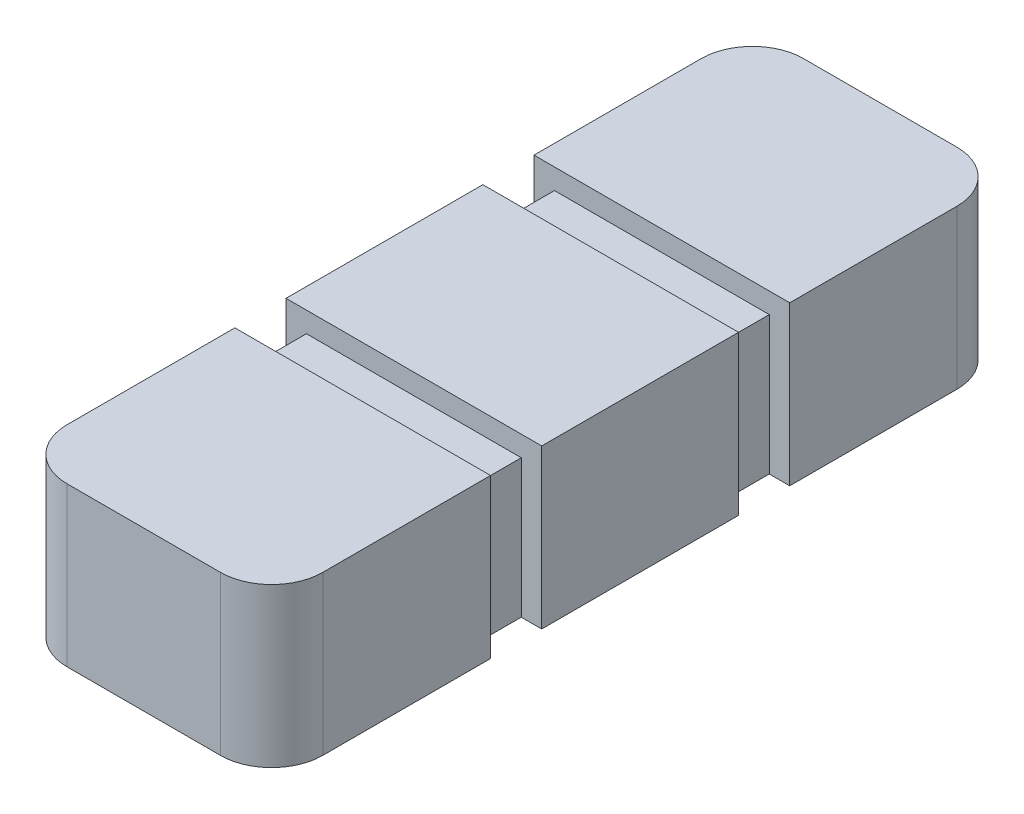
ISO-10303-21;
HEADER;
FILE_DESCRIPTION(('STEP AP214'),'2;1');
FILE_NAME('part.step','',(''),(''),'','','');
FILE_SCHEMA(('AUTOMOTIVE_DESIGN { 1 0 10303 214 1 1 1 1 }'));
ENDSEC;
DATA;
#1=APPLICATION_CONTEXT('core data for automotive mechanical design processes');
#2=APPLICATION_PROTOCOL_DEFINITION('international standard','automotive_design',2000,#1);
#3=PRODUCT_CONTEXT('',#1,'mechanical');
#4=PRODUCT('Part','Part','',(#3));
#5=PRODUCT_RELATED_PRODUCT_CATEGORY('part','',(#4));
#6=PRODUCT_DEFINITION_FORMATION('','',#4);
#7=PRODUCT_DEFINITION_CONTEXT('part definition',#1,'design');
#8=PRODUCT_DEFINITION('design','',#6,#7);
#9=PRODUCT_DEFINITION_SHAPE('','',#8);
#10=(LENGTH_UNIT() NAMED_UNIT(*) SI_UNIT(.MILLI.,.METRE.));
#11=(NAMED_UNIT(*) PLANE_ANGLE_UNIT() SI_UNIT($,.RADIAN.));
#12=(NAMED_UNIT(*) SI_UNIT($,.STERADIAN.) SOLID_ANGLE_UNIT());
#13=UNCERTAINTY_MEASURE_WITH_UNIT(LENGTH_MEASURE(1.E-05),#10,'distance_accuracy_value','');
#14=(GEOMETRIC_REPRESENTATION_CONTEXT(3) GLOBAL_UNCERTAINTY_ASSIGNED_CONTEXT((#13)) GLOBAL_UNIT_ASSIGNED_CONTEXT((#10,
#11,#12)) REPRESENTATION_CONTEXT('',''));
#15=CARTESIAN_POINT('',(0.,0.,0.));
#16=DIRECTION('',(0.,0.,1.));
#17=DIRECTION('',(1.,0.,0.));
#18=AXIS2_PLACEMENT_3D('',#15,#16,#17);
#19=CARTESIAN_POINT('',(1.5,2.325,12.369447531097));
#20=DIRECTION('',(1.,0.,0.));
#21=DIRECTION('',(0.,0.,-1.));
#22=AXIS2_PLACEMENT_3D('',#19,#20,#21);
#23=PLANE('',#22);
#24=DIRECTION('',(0.,0.,-1.));
#25=VECTOR('',#24,1.);
#26=CARTESIAN_POINT('',(1.5,1.65,11.764723765548));
#27=LINE('',#26,#25);
#28=CARTESIAN_POINT('',(1.5,1.65,12.619447531097));
#29=VERTEX_POINT('',#28);
#30=CARTESIAN_POINT('',(1.5,1.65,12.119447531097));
#31=VERTEX_POINT('',#30);
#32=EDGE_CURVE('E367',#29,#31,#27,.T.);
#33=ORIENTED_EDGE('',*,*,#32,.F.);
#34=DIRECTION('',(0.,-1.,0.));
#35=VECTOR('',#34,1.);
#36=CARTESIAN_POINT('',(1.5,3.,12.619447531097));
#37=LINE('',#36,#35);
#38=CARTESIAN_POINT('',(1.5,3.,12.619447531097));
#39=VERTEX_POINT('',#38);
#40=EDGE_CURVE('E36',#39,#29,#37,.T.);
#41=ORIENTED_EDGE('',*,*,#40,.F.);
#42=DIRECTION('',(0.,0.,1.));
#43=VECTOR('',#42,1.);
#44=CARTESIAN_POINT('',(1.5,3.,12.369447531097));
#45=LINE('',#44,#43);
#46=CARTESIAN_POINT('',(1.5,3.,12.119447531097));
#47=VERTEX_POINT('',#46);
#48=EDGE_CURVE('E239',#47,#39,#45,.T.);
#49=ORIENTED_EDGE('',*,*,#48,.F.);
#50=DIRECTION('',(0.,1.,0.));
#51=VECTOR('',#50,1.);
#52=CARTESIAN_POINT('',(1.5,1.65,12.119447531097));
#53=LINE('',#52,#51);
#54=EDGE_CURVE('E258',#31,#47,#53,.T.);
#55=ORIENTED_EDGE('',*,*,#54,.F.);
#56=EDGE_LOOP('',(#33,#41,#49,#55));
#57=FACE_BOUND('',#56,.T.);
#58=ADVANCED_FACE('F17',(#57),#23,.F.);
#59=CARTESIAN_POINT('',(1.5,2.325,9.945));
#60=DIRECTION('',(1.,0.,0.));
#61=DIRECTION('',(0.,0.,-1.));
#62=AXIS2_PLACEMENT_3D('',#59,#60,#61);
#63=PLANE('',#62);
#64=DIRECTION('',(0.,0.,-1.));
#65=VECTOR('',#64,1.);
#66=CARTESIAN_POINT('',(1.5,1.65,10.5525));
#67=LINE('',#66,#65);
#68=CARTESIAN_POINT('',(1.5,1.65,10.195));
#69=VERTEX_POINT('',#68);
#70=CARTESIAN_POINT('',(1.5,1.65,9.695));
#71=VERTEX_POINT('',#70);
#72=EDGE_CURVE('E375',#69,#71,#67,.T.);
#73=ORIENTED_EDGE('',*,*,#72,.F.);
#74=DIRECTION('',(0.,-1.,0.));
#75=VECTOR('',#74,1.);
#76=CARTESIAN_POINT('',(1.5,3.,10.195));
#77=LINE('',#76,#75);
#78=CARTESIAN_POINT('',(1.5,3.,10.195));
#79=VERTEX_POINT('',#78);
#80=EDGE_CURVE('E285',#79,#69,#77,.T.);
#81=ORIENTED_EDGE('',*,*,#80,.F.);
#82=DIRECTION('',(0.,0.,1.));
#83=VECTOR('',#82,1.);
#84=CARTESIAN_POINT('',(1.5,3.,9.945));
#85=LINE('',#84,#83);
#86=CARTESIAN_POINT('',(1.5,3.,9.695));
#87=VERTEX_POINT('',#86);
#88=EDGE_CURVE('E251',#87,#79,#85,.T.);
#89=ORIENTED_EDGE('',*,*,#88,.F.);
#90=DIRECTION('',(0.,1.,0.));
#91=VECTOR('',#90,1.);
#92=CARTESIAN_POINT('',(1.5,1.65,9.695));
#93=LINE('',#92,#91);
#94=EDGE_CURVE('E288',#71,#87,#93,.T.);
#95=ORIENTED_EDGE('',*,*,#94,.F.);
#96=EDGE_LOOP('',(#73,#81,#89,#95));
#97=FACE_BOUND('',#96,.T.);
#98=ADVANCED_FACE('F408',(#97),#63,.F.);
#99=CARTESIAN_POINT('',(1.3,1.65,7.56));
#100=DIRECTION('',(-1.,0.,0.));
#101=DIRECTION('',(0.,0.,1.));
#102=AXIS2_PLACEMENT_3D('',#99,#100,#101);
#103=PLANE('',#102);
#104=DIRECTION('',(0.,1.,0.));
#105=VECTOR('',#104,1.);
#106=CARTESIAN_POINT('',(1.3,2.425,9.695));
#107=LINE('',#106,#105);
#108=CARTESIAN_POINT('',(1.3,1.65,9.695));
#109=VERTEX_POINT('',#108);
#110=CARTESIAN_POINT('',(1.3,3.2,9.695));
#111=VERTEX_POINT('',#110);
#112=EDGE_CURVE('E11',#109,#111,#107,.T.);
#113=ORIENTED_EDGE('',*,*,#112,.T.);
#114=DIRECTION('',(0.,0.,1.));
#115=VECTOR('',#114,1.);
#116=CARTESIAN_POINT('',(1.3,3.2,14.76));
#117=LINE('',#116,#115);
#118=CARTESIAN_POINT('',(1.3,3.2,8.06));
#119=VERTEX_POINT('',#118);
#120=EDGE_CURVE('E199',#119,#111,#117,.T.);
#121=ORIENTED_EDGE('',*,*,#120,.F.);
#122=DIRECTION('',(0.,1.,0.));
#123=VECTOR('',#122,1.);
#124=CARTESIAN_POINT('',(1.3,1.65,8.06));
#125=LINE('',#124,#123);
#126=CARTESIAN_POINT('',(1.3,1.65,8.06));
#127=VERTEX_POINT('',#126);
#128=EDGE_CURVE('E188',#127,#119,#125,.T.);
#129=ORIENTED_EDGE('',*,*,#128,.F.);
#130=DIRECTION('',(0.,0.,-1.));
#131=VECTOR('',#130,1.);
#132=CARTESIAN_POINT('',(1.3,1.65,14.76));
#133=LINE('',#132,#131);
#134=EDGE_CURVE('E378',#109,#127,#133,.T.);
#135=ORIENTED_EDGE('',*,*,#134,.F.);
#136=EDGE_LOOP('',(#113,#121,#129,#135));
#137=FACE_BOUND('',#136,.T.);
#138=ADVANCED_FACE('F415',(#137),#103,.T.);
#139=CARTESIAN_POINT('',(1.3,1.65,7.56));
#140=DIRECTION('',(-1.,0.,0.));
#141=DIRECTION('',(0.,0.,1.));
#142=AXIS2_PLACEMENT_3D('',#139,#140,#141);
#143=PLANE('',#142);
#144=DIRECTION('',(0.,1.,0.));
#145=VECTOR('',#144,1.);
#146=CARTESIAN_POINT('',(1.3,2.425,12.119447531097));
#147=LINE('',#146,#145);
#148=CARTESIAN_POINT('',(1.3,1.65,12.119447531097));
#149=VERTEX_POINT('',#148);
#150=CARTESIAN_POINT('',(1.3,3.2,12.119447531097));
#151=VERTEX_POINT('',#150);
#152=EDGE_CURVE('E27',#149,#151,#147,.T.);
#153=ORIENTED_EDGE('',*,*,#152,.T.);
#154=DIRECTION('',(0.,0.,1.));
#155=VECTOR('',#154,1.);
#156=CARTESIAN_POINT('',(1.3,3.2,14.76));
#157=LINE('',#156,#155);
#158=CARTESIAN_POINT('',(1.3,3.2,10.195));
#159=VERTEX_POINT('',#158);
#160=EDGE_CURVE('E291',#159,#151,#157,.T.);
#161=ORIENTED_EDGE('',*,*,#160,.F.);
#162=DIRECTION('',(0.,-1.,0.));
#163=VECTOR('',#162,1.);
#164=CARTESIAN_POINT('',(1.3,2.425,10.195));
#165=LINE('',#164,#163);
#166=CARTESIAN_POINT('',(1.3,1.65,10.195));
#167=VERTEX_POINT('',#166);
#168=EDGE_CURVE('E389',#159,#167,#165,.T.);
#169=ORIENTED_EDGE('',*,*,#168,.T.);
#170=DIRECTION('',(0.,0.,-1.));
#171=VECTOR('',#170,1.);
#172=CARTESIAN_POINT('',(1.3,1.65,14.76));
#173=LINE('',#172,#171);
#174=EDGE_CURVE('E371',#149,#167,#173,.T.);
#175=ORIENTED_EDGE('',*,*,#174,.F.);
#176=EDGE_LOOP('',(#153,#161,#169,#175));
#177=FACE_BOUND('',#176,.T.);
#178=ADVANCED_FACE('F398',(#177),#143,.T.);
#179=CARTESIAN_POINT('',(1.3,1.65,7.56));
#180=DIRECTION('',(-1.,0.,0.));
#181=DIRECTION('',(0.,0.,1.));
#182=AXIS2_PLACEMENT_3D('',#179,#180,#181);
#183=PLANE('',#182);
#184=DIRECTION('',(0.,-1.,0.));
#185=VECTOR('',#184,1.);
#186=CARTESIAN_POINT('',(1.3,2.425,12.619447531097));
#187=LINE('',#186,#185);
#188=CARTESIAN_POINT('',(1.3,3.2,12.619447531097));
#189=VERTEX_POINT('',#188);
#190=CARTESIAN_POINT('',(1.3,1.65,12.619447531097));
#191=VERTEX_POINT('',#190);
#192=EDGE_CURVE('E357',#189,#191,#187,.T.);
#193=ORIENTED_EDGE('',*,*,#192,.T.);
#194=DIRECTION('',(0.,0.,-1.));
#195=VECTOR('',#194,1.);
#196=CARTESIAN_POINT('',(1.3,1.65,14.76));
#197=LINE('',#196,#195);
#198=CARTESIAN_POINT('',(1.3,1.65,14.26));
#199=VERTEX_POINT('',#198);
#200=EDGE_CURVE('E227',#199,#191,#197,.T.);
#201=ORIENTED_EDGE('',*,*,#200,.F.);
#202=DIRECTION('',(0.,-1.,0.));
#203=VECTOR('',#202,1.);
#204=CARTESIAN_POINT('',(1.3,1.65,14.26));
#205=LINE('',#204,#203);
#206=CARTESIAN_POINT('',(1.3,3.2,14.26));
#207=VERTEX_POINT('',#206);
#208=EDGE_CURVE('E230',#207,#199,#205,.T.);
#209=ORIENTED_EDGE('',*,*,#208,.F.);
#210=DIRECTION('',(0.,0.,1.));
#211=VECTOR('',#210,1.);
#212=CARTESIAN_POINT('',(1.3,3.2,14.76));
#213=LINE('',#212,#211);
#214=EDGE_CURVE('E295',#189,#207,#213,.T.);
#215=ORIENTED_EDGE('',*,*,#214,.F.);
#216=EDGE_LOOP('',(#193,#201,#209,#215));
#217=FACE_BOUND('',#216,.T.);
#218=ADVANCED_FACE('F355',(#217),#183,.T.);
#219=CARTESIAN_POINT('',(2.55,1.65,11.16));
#220=DIRECTION('',(0.,1.,0.));
#221=DIRECTION('',(-1.,0.,0.));
#222=AXIS2_PLACEMENT_3D('',#219,#220,#221);
#223=PLANE('',#222);
#224=DIRECTION('',(1.,0.,0.));
#225=VECTOR('',#224,1.);
#226=CARTESIAN_POINT('',(1.925,1.65,12.619447531097));
#227=LINE('',#226,#225);
#228=EDGE_CURVE('E365',#191,#29,#227,.T.);
#229=ORIENTED_EDGE('',*,*,#228,.T.);
#230=ORIENTED_EDGE('',*,*,#32,.T.);
#231=DIRECTION('',(-1.,0.,0.));
#232=VECTOR('',#231,1.);
#233=CARTESIAN_POINT('',(1.925,1.65,12.119447531097));
#234=LINE('',#233,#232);
#235=EDGE_CURVE('E368',#31,#149,#234,.T.);
#236=ORIENTED_EDGE('',*,*,#235,.T.);
#237=ORIENTED_EDGE('',*,*,#174,.T.);
#238=DIRECTION('',(1.,0.,0.));
#239=VECTOR('',#238,1.);
#240=CARTESIAN_POINT('',(1.925,1.65,10.195));
#241=LINE('',#240,#239);
#242=EDGE_CURVE('E372',#167,#69,#241,.T.);
#243=ORIENTED_EDGE('',*,*,#242,.T.);
#244=ORIENTED_EDGE('',*,*,#72,.T.);
#245=DIRECTION('',(-1.,0.,0.));
#246=VECTOR('',#245,1.);
#247=CARTESIAN_POINT('',(1.925,1.65,9.695));
#248=LINE('',#247,#246);
#249=EDGE_CURVE('E376',#71,#109,#248,.T.);
#250=ORIENTED_EDGE('',*,*,#249,.T.);
#251=ORIENTED_EDGE('',*,*,#134,.T.);
#252=CARTESIAN_POINT('',(1.8,1.65,8.06));
#253=DIRECTION('',(0.,1.,0.));
#254=DIRECTION('',(-0.707106781186548,0.,-0.707106781186548));
#255=AXIS2_PLACEMENT_3D('',#252,#253,#254);
#256=CIRCLE('',#255,0.5);
#257=CARTESIAN_POINT('',(1.8,1.65,7.56));
#258=VERTEX_POINT('',#257);
#259=EDGE_CURVE('E205',#258,#127,#256,.T.);
#260=ORIENTED_EDGE('',*,*,#259,.F.);
#261=DIRECTION('',(1.,0.,0.));
#262=VECTOR('',#261,1.);
#263=CARTESIAN_POINT('',(1.3,1.65,7.56));
#264=LINE('',#263,#262);
#265=CARTESIAN_POINT('',(3.3,1.65,7.56));
#266=VERTEX_POINT('',#265);
#267=EDGE_CURVE('E204',#258,#266,#264,.T.);
#268=ORIENTED_EDGE('',*,*,#267,.T.);
#269=CARTESIAN_POINT('',(3.3,1.65,8.06));
#270=DIRECTION('',(0.,1.,0.));
#271=DIRECTION('',(0.707106781186548,0.,-0.707106781186548));
#272=AXIS2_PLACEMENT_3D('',#269,#270,#271);
#273=CIRCLE('',#272,0.5);
#274=CARTESIAN_POINT('',(3.8,1.65,8.06));
#275=VERTEX_POINT('',#274);
#276=EDGE_CURVE('E265',#275,#266,#273,.T.);
#277=ORIENTED_EDGE('',*,*,#276,.F.);
#278=DIRECTION('',(0.,0.,1.));
#279=VECTOR('',#278,1.);
#280=CARTESIAN_POINT('',(3.8,1.65,7.56));
#281=LINE('',#280,#279);
#282=CARTESIAN_POINT('',(3.8,1.65,9.695));
#283=VERTEX_POINT('',#282);
#284=EDGE_CURVE('E308',#275,#283,#281,.T.);
#285=ORIENTED_EDGE('',*,*,#284,.T.);
#286=DIRECTION('',(-1.,0.,0.));
#287=VECTOR('',#286,1.);
#288=CARTESIAN_POINT('',(3.175,1.65,9.695));
#289=LINE('',#288,#287);
#290=CARTESIAN_POINT('',(3.6,1.65,9.695));
#291=VERTEX_POINT('',#290);
#292=EDGE_CURVE('E311',#283,#291,#289,.T.);
#293=ORIENTED_EDGE('',*,*,#292,.T.);
#294=DIRECTION('',(0.,0.,1.));
#295=VECTOR('',#294,1.);
#296=CARTESIAN_POINT('',(3.6,1.65,10.5525));
#297=LINE('',#296,#295);
#298=CARTESIAN_POINT('',(3.6,1.65,10.195));
#299=VERTEX_POINT('',#298);
#300=EDGE_CURVE('E314',#291,#299,#297,.T.);
#301=ORIENTED_EDGE('',*,*,#300,.T.);
#302=DIRECTION('',(1.,0.,0.));
#303=VECTOR('',#302,1.);
#304=CARTESIAN_POINT('',(3.175,1.65,10.195));
#305=LINE('',#304,#303);
#306=CARTESIAN_POINT('',(3.8,1.65,10.195));
#307=VERTEX_POINT('',#306);
#308=EDGE_CURVE('E317',#299,#307,#305,.T.);
#309=ORIENTED_EDGE('',*,*,#308,.T.);
#310=DIRECTION('',(0.,0.,1.));
#311=VECTOR('',#310,1.);
#312=CARTESIAN_POINT('',(3.8,1.65,7.56));
#313=LINE('',#312,#311);
#314=CARTESIAN_POINT('',(3.8,1.65,12.119447531097));
#315=VERTEX_POINT('',#314);
#316=EDGE_CURVE('E320',#307,#315,#313,.T.);
#317=ORIENTED_EDGE('',*,*,#316,.T.);
#318=DIRECTION('',(-1.,0.,0.));
#319=VECTOR('',#318,1.);
#320=CARTESIAN_POINT('',(3.175,1.65,12.119447531097));
#321=LINE('',#320,#319);
#322=CARTESIAN_POINT('',(3.6,1.65,12.119447531097));
#323=VERTEX_POINT('',#322);
#324=EDGE_CURVE('E323',#315,#323,#321,.T.);
#325=ORIENTED_EDGE('',*,*,#324,.T.);
#326=DIRECTION('',(0.,0.,1.));
#327=VECTOR('',#326,1.);
#328=CARTESIAN_POINT('',(3.6,1.65,11.764723765548));
#329=LINE('',#328,#327);
#330=CARTESIAN_POINT('',(3.6,1.65,12.619447531097));
#331=VERTEX_POINT('',#330);
#332=EDGE_CURVE('E326',#323,#331,#329,.T.);
#333=ORIENTED_EDGE('',*,*,#332,.T.);
#334=DIRECTION('',(1.,0.,0.));
#335=VECTOR('',#334,1.);
#336=CARTESIAN_POINT('',(3.175,1.65,12.619447531097));
#337=LINE('',#336,#335);
#338=CARTESIAN_POINT('',(3.8,1.65,12.619447531097));
#339=VERTEX_POINT('',#338);
#340=EDGE_CURVE('E328',#331,#339,#337,.T.);
#341=ORIENTED_EDGE('',*,*,#340,.T.);
#342=DIRECTION('',(0.,0.,1.));
#343=VECTOR('',#342,1.);
#344=CARTESIAN_POINT('',(3.8,1.65,7.56));
#345=LINE('',#344,#343);
#346=CARTESIAN_POINT('',(3.8,1.65,14.26));
#347=VERTEX_POINT('',#346);
#348=EDGE_CURVE('E222',#339,#347,#345,.T.);
#349=ORIENTED_EDGE('',*,*,#348,.T.);
#350=CARTESIAN_POINT('',(3.3,1.65,14.26));
#351=DIRECTION('',(0.,1.,0.));
#352=DIRECTION('',(0.707106781186548,0.,0.707106781186548));
#353=AXIS2_PLACEMENT_3D('',#350,#351,#352);
#354=CIRCLE('',#353,0.5);
#355=CARTESIAN_POINT('',(3.3,1.65,14.76));
#356=VERTEX_POINT('',#355);
#357=EDGE_CURVE('E212',#356,#347,#354,.T.);
#358=ORIENTED_EDGE('',*,*,#357,.F.);
#359=DIRECTION('',(-1.,0.,0.));
#360=VECTOR('',#359,1.);
#361=CARTESIAN_POINT('',(3.8,1.65,14.76));
#362=LINE('',#361,#360);
#363=CARTESIAN_POINT('',(1.8,1.65,14.76));
#364=VERTEX_POINT('',#363);
#365=EDGE_CURVE('E224',#356,#364,#362,.T.);
#366=ORIENTED_EDGE('',*,*,#365,.T.);
#367=CARTESIAN_POINT('',(1.8,1.65,14.26));
#368=DIRECTION('',(0.,1.,0.));
#369=DIRECTION('',(-0.707106781186548,0.,0.707106781186548));
#370=AXIS2_PLACEMENT_3D('',#367,#368,#369);
#371=CIRCLE('',#370,0.5);
#372=EDGE_CURVE('E228',#199,#364,#371,.T.);
#373=ORIENTED_EDGE('',*,*,#372,.F.);
#374=ORIENTED_EDGE('',*,*,#200,.T.);
#375=EDGE_LOOP('',(#229,#230,#236,#237,#243,#244,#250,#251,#260,#268,#277,#285,#293,#301,#309,
#317,#325,#333,#341,#349,#358,#366,#373,#374));
#376=FACE_BOUND('',#375,.T.);
#377=ADVANCED_FACE('F334',(#376),#223,.F.);
#378=CARTESIAN_POINT('',(3.6,2.325,12.369447531097));
#379=DIRECTION('',(-1.,0.,0.));
#380=DIRECTION('',(0.,0.,1.));
#381=AXIS2_PLACEMENT_3D('',#378,#379,#380);
#382=PLANE('',#381);
#383=DIRECTION('',(0.,-1.,0.));
#384=VECTOR('',#383,1.);
#385=CARTESIAN_POINT('',(3.6,1.65,12.119447531097));
#386=LINE('',#385,#384);
#387=CARTESIAN_POINT('',(3.6,3.,12.119447531097));
#388=VERTEX_POINT('',#387);
#389=EDGE_CURVE('E231',#388,#323,#386,.T.);
#390=ORIENTED_EDGE('',*,*,#389,.F.);
#391=DIRECTION('',(0.,0.,-1.));
#392=VECTOR('',#391,1.);
#393=CARTESIAN_POINT('',(3.6,3.,12.369447531097));
#394=LINE('',#393,#392);
#395=CARTESIAN_POINT('',(3.6,3.,12.619447531097));
#396=VERTEX_POINT('',#395);
#397=EDGE_CURVE('E236',#396,#388,#394,.T.);
#398=ORIENTED_EDGE('',*,*,#397,.F.);
#399=DIRECTION('',(0.,1.,0.));
#400=VECTOR('',#399,1.);
#401=CARTESIAN_POINT('',(3.6,3.,12.619447531097));
#402=LINE('',#401,#400);
#403=EDGE_CURVE('E241',#331,#396,#402,.T.);
#404=ORIENTED_EDGE('',*,*,#403,.F.);
#405=ORIENTED_EDGE('',*,*,#332,.F.);
#406=EDGE_LOOP('',(#390,#398,#404,#405));
#407=FACE_BOUND('',#406,.T.);
#408=ADVANCED_FACE('F468',(#407),#382,.F.);
#409=CARTESIAN_POINT('',(3.6,2.325,9.945));
#410=DIRECTION('',(-1.,0.,0.));
#411=DIRECTION('',(0.,0.,1.));
#412=AXIS2_PLACEMENT_3D('',#409,#410,#411);
#413=PLANE('',#412);
#414=DIRECTION('',(0.,-1.,0.));
#415=VECTOR('',#414,1.);
#416=CARTESIAN_POINT('',(3.6,1.65,9.695));
#417=LINE('',#416,#415);
#418=CARTESIAN_POINT('',(3.6,3.,9.695));
#419=VERTEX_POINT('',#418);
#420=EDGE_CURVE('E243',#419,#291,#417,.T.);
#421=ORIENTED_EDGE('',*,*,#420,.F.);
#422=DIRECTION('',(0.,0.,-1.));
#423=VECTOR('',#422,1.);
#424=CARTESIAN_POINT('',(3.6,3.,9.945));
#425=LINE('',#424,#423);
#426=CARTESIAN_POINT('',(3.6,3.,10.195));
#427=VERTEX_POINT('',#426);
#428=EDGE_CURVE('E248',#427,#419,#425,.T.);
#429=ORIENTED_EDGE('',*,*,#428,.F.);
#430=DIRECTION('',(0.,1.,0.));
#431=VECTOR('',#430,1.);
#432=CARTESIAN_POINT('',(3.6,3.,10.195));
#433=LINE('',#432,#431);
#434=EDGE_CURVE('E252',#299,#427,#433,.T.);
#435=ORIENTED_EDGE('',*,*,#434,.F.);
#436=ORIENTED_EDGE('',*,*,#300,.F.);
#437=EDGE_LOOP('',(#421,#429,#435,#436));
#438=FACE_BOUND('',#437,.T.);
#439=ADVANCED_FACE('F435',(#438),#413,.F.);
#440=CARTESIAN_POINT('',(2.55,3.,12.369447531097));
#441=DIRECTION('',(0.,-1.,0.));
#442=DIRECTION('',(0.,0.,-1.));
#443=AXIS2_PLACEMENT_3D('',#440,#441,#442);
#444=PLANE('',#443);
#445=ORIENTED_EDGE('',*,*,#48,.T.);
#446=DIRECTION('',(-1.,0.,0.));
#447=VECTOR('',#446,1.);
#448=CARTESIAN_POINT('',(3.8,3.,12.619447531097));
#449=LINE('',#448,#447);
#450=EDGE_CURVE('E244',#396,#39,#449,.T.);
#451=ORIENTED_EDGE('',*,*,#450,.F.);
#452=ORIENTED_EDGE('',*,*,#397,.T.);
#453=DIRECTION('',(1.,0.,0.));
#454=VECTOR('',#453,1.);
#455=CARTESIAN_POINT('',(1.3,3.,12.119447531097));
#456=LINE('',#455,#454);
#457=EDGE_CURVE('E234',#47,#388,#456,.T.);
#458=ORIENTED_EDGE('',*,*,#457,.F.);
#459=EDGE_LOOP('',(#445,#451,#452,#458));
#460=FACE_BOUND('',#459,.T.);
#461=ADVANCED_FACE('F443',(#460),#444,.F.);
#462=CARTESIAN_POINT('',(3.8,1.65,14.76));
#463=DIRECTION('',(1.,0.,0.));
#464=DIRECTION('',(0.,0.,-1.));
#465=AXIS2_PLACEMENT_3D('',#462,#463,#464);
#466=PLANE('',#465);
#467=DIRECTION('',(0.,-1.,0.));
#468=VECTOR('',#467,1.);
#469=CARTESIAN_POINT('',(3.8,2.425,9.695));
#470=LINE('',#469,#468);
#471=CARTESIAN_POINT('',(3.8,3.2,9.695));
#472=VERTEX_POINT('',#471);
#473=EDGE_CURVE('E240',#472,#283,#470,.T.);
#474=ORIENTED_EDGE('',*,*,#473,.T.);
#475=ORIENTED_EDGE('',*,*,#284,.F.);
#476=DIRECTION('',(0.,-1.,0.));
#477=VECTOR('',#476,1.);
#478=CARTESIAN_POINT('',(3.8,1.65,8.06));
#479=LINE('',#478,#477);
#480=CARTESIAN_POINT('',(3.8,3.2,8.06));
#481=VERTEX_POINT('',#480);
#482=EDGE_CURVE('E262',#481,#275,#479,.T.);
#483=ORIENTED_EDGE('',*,*,#482,.F.);
#484=DIRECTION('',(0.,0.,-1.));
#485=VECTOR('',#484,1.);
#486=CARTESIAN_POINT('',(3.8,3.2,7.56));
#487=LINE('',#486,#485);
#488=EDGE_CURVE('E198',#472,#481,#487,.T.);
#489=ORIENTED_EDGE('',*,*,#488,.F.);
#490=EDGE_LOOP('',(#474,#475,#483,#489));
#491=FACE_BOUND('',#490,.T.);
#492=ADVANCED_FACE('F441',(#491),#466,.T.);
#493=CARTESIAN_POINT('',(3.8,1.65,14.76));
#494=DIRECTION('',(1.,0.,0.));
#495=DIRECTION('',(0.,0.,-1.));
#496=AXIS2_PLACEMENT_3D('',#493,#494,#495);
#497=PLANE('',#496);
#498=DIRECTION('',(0.,-1.,0.));
#499=VECTOR('',#498,1.);
#500=CARTESIAN_POINT('',(3.8,2.425,12.119447531097));
#501=LINE('',#500,#499);
#502=CARTESIAN_POINT('',(3.8,3.2,12.119447531097));
#503=VERTEX_POINT('',#502);
#504=EDGE_CURVE('E261',#503,#315,#501,.T.);
#505=ORIENTED_EDGE('',*,*,#504,.T.);
#506=ORIENTED_EDGE('',*,*,#316,.F.);
#507=DIRECTION('',(0.,1.,0.));
#508=VECTOR('',#507,1.);
#509=CARTESIAN_POINT('',(3.8,2.425,10.195));
#510=LINE('',#509,#508);
#511=CARTESIAN_POINT('',(3.8,3.2,10.195));
#512=VERTEX_POINT('',#511);
#513=EDGE_CURVE('E270',#307,#512,#510,.T.);
#514=ORIENTED_EDGE('',*,*,#513,.T.);
#515=DIRECTION('',(0.,0.,-1.));
#516=VECTOR('',#515,1.);
#517=CARTESIAN_POINT('',(3.8,3.2,7.56));
#518=LINE('',#517,#516);
#519=EDGE_CURVE('E274',#503,#512,#518,.T.);
#520=ORIENTED_EDGE('',*,*,#519,.F.);
#521=EDGE_LOOP('',(#505,#506,#514,#520));
#522=FACE_BOUND('',#521,.T.);
#523=ADVANCED_FACE('F431',(#522),#497,.T.);
#524=CARTESIAN_POINT('',(3.8,1.65,14.76));
#525=DIRECTION('',(1.,0.,0.));
#526=DIRECTION('',(0.,0.,-1.));
#527=AXIS2_PLACEMENT_3D('',#524,#525,#526);
#528=PLANE('',#527);
#529=DIRECTION('',(0.,1.,0.));
#530=VECTOR('',#529,1.);
#531=CARTESIAN_POINT('',(3.8,2.425,12.619447531097));
#532=LINE('',#531,#530);
#533=CARTESIAN_POINT('',(3.8,3.2,12.619447531097));
#534=VERTEX_POINT('',#533);
#535=EDGE_CURVE('E273',#339,#534,#532,.T.);
#536=ORIENTED_EDGE('',*,*,#535,.T.);
#537=DIRECTION('',(0.,0.,-1.));
#538=VECTOR('',#537,1.);
#539=CARTESIAN_POINT('',(3.8,3.2,7.56));
#540=LINE('',#539,#538);
#541=CARTESIAN_POINT('',(3.8,3.2,14.26));
#542=VERTEX_POINT('',#541);
#543=EDGE_CURVE('E279',#542,#534,#540,.T.);
#544=ORIENTED_EDGE('',*,*,#543,.F.);
#545=DIRECTION('',(0.,1.,0.));
#546=VECTOR('',#545,1.);
#547=CARTESIAN_POINT('',(3.8,1.65,14.26));
#548=LINE('',#547,#546);
#549=EDGE_CURVE('E216',#347,#542,#548,.T.);
#550=ORIENTED_EDGE('',*,*,#549,.F.);
#551=ORIENTED_EDGE('',*,*,#348,.F.);
#552=EDGE_LOOP('',(#536,#544,#550,#551));
#553=FACE_BOUND('',#552,.T.);
#554=ADVANCED_FACE('F338',(#553),#528,.T.);
#555=CARTESIAN_POINT('',(2.55,3.,9.945));
#556=DIRECTION('',(0.,-1.,0.));
#557=DIRECTION('',(0.,0.,-1.));
#558=AXIS2_PLACEMENT_3D('',#555,#556,#557);
#559=PLANE('',#558);
#560=ORIENTED_EDGE('',*,*,#88,.T.);
#561=DIRECTION('',(-1.,0.,0.));
#562=VECTOR('',#561,1.);
#563=CARTESIAN_POINT('',(3.8,3.,10.195));
#564=LINE('',#563,#562);
#565=EDGE_CURVE('E254',#427,#79,#564,.T.);
#566=ORIENTED_EDGE('',*,*,#565,.F.);
#567=ORIENTED_EDGE('',*,*,#428,.T.);
#568=DIRECTION('',(1.,0.,0.));
#569=VECTOR('',#568,1.);
#570=CARTESIAN_POINT('',(1.3,3.,9.695));
#571=LINE('',#570,#569);
#572=EDGE_CURVE('E247',#87,#419,#571,.T.);
#573=ORIENTED_EDGE('',*,*,#572,.F.);
#574=EDGE_LOOP('',(#560,#566,#567,#573));
#575=FACE_BOUND('',#574,.T.);
#576=ADVANCED_FACE('F438',(#575),#559,.F.);
#577=CARTESIAN_POINT('',(3.8,3.2,10.195));
#578=DIRECTION('',(0.,0.,1.));
#579=DIRECTION('',(-1.,0.,0.));
#580=AXIS2_PLACEMENT_3D('',#577,#578,#579);
#581=PLANE('',#580);
#582=DIRECTION('',(-1.,0.,0.));
#583=VECTOR('',#582,1.);
#584=CARTESIAN_POINT('',(3.175,3.2,10.195));
#585=LINE('',#584,#583);
#586=EDGE_CURVE('E281',#512,#159,#585,.T.);
#587=ORIENTED_EDGE('',*,*,#586,.F.);
#588=ORIENTED_EDGE('',*,*,#513,.F.);
#589=ORIENTED_EDGE('',*,*,#308,.F.);
#590=ORIENTED_EDGE('',*,*,#434,.T.);
#591=ORIENTED_EDGE('',*,*,#565,.T.);
#592=ORIENTED_EDGE('',*,*,#80,.T.);
#593=ORIENTED_EDGE('',*,*,#242,.F.);
#594=ORIENTED_EDGE('',*,*,#168,.F.);
#595=EDGE_LOOP('',(#587,#588,#589,#590,#591,#592,#593,#594));
#596=FACE_BOUND('',#595,.T.);
#597=ADVANCED_FACE('F401',(#596),#581,.F.);
#598=CARTESIAN_POINT('',(1.3,3.2,9.695));
#599=DIRECTION('',(0.,0.,-1.));
#600=DIRECTION('',(1.,0.,0.));
#601=AXIS2_PLACEMENT_3D('',#598,#599,#600);
#602=PLANE('',#601);
#603=DIRECTION('',(1.,0.,0.));
#604=VECTOR('',#603,1.);
#605=CARTESIAN_POINT('',(1.925,3.2,9.695));
#606=LINE('',#605,#604);
#607=EDGE_CURVE('E267',#111,#472,#606,.T.);
#608=ORIENTED_EDGE('',*,*,#607,.F.);
#609=ORIENTED_EDGE('',*,*,#112,.F.);
#610=ORIENTED_EDGE('',*,*,#249,.F.);
#611=ORIENTED_EDGE('',*,*,#94,.T.);
#612=ORIENTED_EDGE('',*,*,#572,.T.);
#613=ORIENTED_EDGE('',*,*,#420,.T.);
#614=ORIENTED_EDGE('',*,*,#292,.F.);
#615=ORIENTED_EDGE('',*,*,#473,.F.);
#616=EDGE_LOOP('',(#608,#609,#610,#611,#612,#613,#614,#615));
#617=FACE_BOUND('',#616,.T.);
#618=ADVANCED_FACE('F412',(#617),#602,.F.);
#619=CARTESIAN_POINT('',(3.8,3.2,12.619447531097));
#620=DIRECTION('',(0.,0.,1.));
#621=DIRECTION('',(-1.,0.,0.));
#622=AXIS2_PLACEMENT_3D('',#619,#620,#621);
#623=PLANE('',#622);
#624=DIRECTION('',(-1.,0.,0.));
#625=VECTOR('',#624,1.);
#626=CARTESIAN_POINT('',(3.175,3.2,12.619447531097));
#627=LINE('',#626,#625);
#628=EDGE_CURVE('E235',#534,#189,#627,.T.);
#629=ORIENTED_EDGE('',*,*,#628,.F.);
#630=ORIENTED_EDGE('',*,*,#535,.F.);
#631=ORIENTED_EDGE('',*,*,#340,.F.);
#632=ORIENTED_EDGE('',*,*,#403,.T.);
#633=ORIENTED_EDGE('',*,*,#450,.T.);
#634=ORIENTED_EDGE('',*,*,#40,.T.);
#635=ORIENTED_EDGE('',*,*,#228,.F.);
#636=ORIENTED_EDGE('',*,*,#192,.F.);
#637=EDGE_LOOP('',(#629,#630,#631,#632,#633,#634,#635,#636));
#638=FACE_BOUND('',#637,.T.);
#639=ADVANCED_FACE('F529',(#638),#623,.F.);
#640=CARTESIAN_POINT('',(1.3,3.2,12.119447531097));
#641=DIRECTION('',(0.,0.,-1.));
#642=DIRECTION('',(1.,0.,0.));
#643=AXIS2_PLACEMENT_3D('',#640,#641,#642);
#644=PLANE('',#643);
#645=DIRECTION('',(1.,0.,0.));
#646=VECTOR('',#645,1.);
#647=CARTESIAN_POINT('',(1.925,3.2,12.119447531097));
#648=LINE('',#647,#646);
#649=EDGE_CURVE('E276',#151,#503,#648,.T.);
#650=ORIENTED_EDGE('',*,*,#649,.F.);
#651=ORIENTED_EDGE('',*,*,#152,.F.);
#652=ORIENTED_EDGE('',*,*,#235,.F.);
#653=ORIENTED_EDGE('',*,*,#54,.T.);
#654=ORIENTED_EDGE('',*,*,#457,.T.);
#655=ORIENTED_EDGE('',*,*,#389,.T.);
#656=ORIENTED_EDGE('',*,*,#324,.F.);
#657=ORIENTED_EDGE('',*,*,#504,.F.);
#658=EDGE_LOOP('',(#650,#651,#652,#653,#654,#655,#656,#657));
#659=FACE_BOUND('',#658,.T.);
#660=ADVANCED_FACE('F424',(#659),#644,.F.);
#661=CARTESIAN_POINT('',(2.55,3.2,11.16));
#662=DIRECTION('',(0.,1.,0.));
#663=DIRECTION('',(0.,0.,1.));
#664=AXIS2_PLACEMENT_3D('',#661,#662,#663);
#665=PLANE('',#664);
#666=ORIENTED_EDGE('',*,*,#628,.T.);
#667=ORIENTED_EDGE('',*,*,#214,.T.);
#668=CARTESIAN_POINT('',(1.8,3.2,14.26));
#669=DIRECTION('',(0.,-1.,0.));
#670=DIRECTION('',(-0.707106781186548,0.,0.707106781186548));
#671=AXIS2_PLACEMENT_3D('',#668,#669,#670);
#672=CIRCLE('',#671,0.5);
#673=CARTESIAN_POINT('',(1.8,3.2,14.76));
#674=VERTEX_POINT('',#673);
#675=EDGE_CURVE('E298',#674,#207,#672,.T.);
#676=ORIENTED_EDGE('',*,*,#675,.F.);
#677=DIRECTION('',(1.,0.,0.));
#678=VECTOR('',#677,1.);
#679=CARTESIAN_POINT('',(3.8,3.2,14.76));
#680=LINE('',#679,#678);
#681=CARTESIAN_POINT('',(3.3,3.2,14.76));
#682=VERTEX_POINT('',#681);
#683=EDGE_CURVE('E280',#674,#682,#680,.T.);
#684=ORIENTED_EDGE('',*,*,#683,.T.);
#685=CARTESIAN_POINT('',(3.3,3.2,14.26));
#686=DIRECTION('',(0.,-1.,0.));
#687=DIRECTION('',(0.707106781186548,0.,0.707106781186548));
#688=AXIS2_PLACEMENT_3D('',#685,#686,#687);
#689=CIRCLE('',#688,0.5);
#690=EDGE_CURVE('E211',#542,#682,#689,.T.);
#691=ORIENTED_EDGE('',*,*,#690,.F.);
#692=ORIENTED_EDGE('',*,*,#543,.T.);
#693=EDGE_LOOP('',(#666,#667,#676,#684,#691,#692));
#694=FACE_BOUND('',#693,.T.);
#695=ADVANCED_FACE('F343',(#694),#665,.T.);
#696=CARTESIAN_POINT('',(2.55,3.2,11.16));
#697=DIRECTION('',(0.,1.,0.));
#698=DIRECTION('',(0.,0.,1.));
#699=AXIS2_PLACEMENT_3D('',#696,#697,#698);
#700=PLANE('',#699);
#701=ORIENTED_EDGE('',*,*,#586,.T.);
#702=ORIENTED_EDGE('',*,*,#160,.T.);
#703=ORIENTED_EDGE('',*,*,#649,.T.);
#704=ORIENTED_EDGE('',*,*,#519,.T.);
#705=EDGE_LOOP('',(#701,#702,#703,#704));
#706=FACE_BOUND('',#705,.T.);
#707=ADVANCED_FACE('F428',(#706),#700,.T.);
#708=CARTESIAN_POINT('',(2.55,3.2,11.16));
#709=DIRECTION('',(0.,1.,0.));
#710=DIRECTION('',(0.,0.,1.));
#711=AXIS2_PLACEMENT_3D('',#708,#709,#710);
#712=PLANE('',#711);
#713=ORIENTED_EDGE('',*,*,#607,.T.);
#714=ORIENTED_EDGE('',*,*,#488,.T.);
#715=CARTESIAN_POINT('',(3.3,3.2,8.06));
#716=DIRECTION('',(0.,-1.,0.));
#717=DIRECTION('',(0.707106781186548,0.,-0.707106781186548));
#718=AXIS2_PLACEMENT_3D('',#715,#716,#717);
#719=CIRCLE('',#718,0.5);
#720=CARTESIAN_POINT('',(3.3,3.2,7.56));
#721=VERTEX_POINT('',#720);
#722=EDGE_CURVE('E177',#721,#481,#719,.T.);
#723=ORIENTED_EDGE('',*,*,#722,.F.);
#724=DIRECTION('',(-1.,0.,0.));
#725=VECTOR('',#724,1.);
#726=CARTESIAN_POINT('',(1.3,3.2,7.56));
#727=LINE('',#726,#725);
#728=CARTESIAN_POINT('',(1.8,3.2,7.56));
#729=VERTEX_POINT('',#728);
#730=EDGE_CURVE('E192',#721,#729,#727,.T.);
#731=ORIENTED_EDGE('',*,*,#730,.T.);
#732=CARTESIAN_POINT('',(1.8,3.2,8.06));
#733=DIRECTION('',(0.,-1.,0.));
#734=DIRECTION('',(-0.707106781186548,0.,-0.707106781186548));
#735=AXIS2_PLACEMENT_3D('',#732,#733,#734);
#736=CIRCLE('',#735,0.5);
#737=EDGE_CURVE('E183',#119,#729,#736,.T.);
#738=ORIENTED_EDGE('',*,*,#737,.F.);
#739=ORIENTED_EDGE('',*,*,#120,.T.);
#740=EDGE_LOOP('',(#713,#714,#723,#731,#738,#739));
#741=FACE_BOUND('',#740,.T.);
#742=ADVANCED_FACE('F194',(#741),#712,.T.);
#743=CARTESIAN_POINT('',(1.8,1.65,14.26));
#744=DIRECTION('',(0.,1.,0.));
#745=DIRECTION('',(-0.707106781186548,0.,0.707106781186548));
#746=AXIS2_PLACEMENT_3D('',#743,#744,#745);
#747=CYLINDRICAL_SURFACE('',#746,0.5);
#748=ORIENTED_EDGE('',*,*,#675,.T.);
#749=ORIENTED_EDGE('',*,*,#208,.T.);
#750=ORIENTED_EDGE('',*,*,#372,.T.);
#751=DIRECTION('',(0.,1.,0.));
#752=VECTOR('',#751,1.);
#753=CARTESIAN_POINT('',(1.8,1.65,14.76));
#754=LINE('',#753,#752);
#755=EDGE_CURVE('E190',#364,#674,#754,.T.);
#756=ORIENTED_EDGE('',*,*,#755,.T.);
#757=EDGE_LOOP('',(#748,#749,#750,#756));
#758=FACE_BOUND('',#757,.T.);
#759=ADVANCED_FACE('F352',(#758),#747,.T.);
#760=CARTESIAN_POINT('',(1.8,1.65,8.06));
#761=DIRECTION('',(0.,1.,0.));
#762=DIRECTION('',(-0.707106781186548,0.,-0.707106781186548));
#763=AXIS2_PLACEMENT_3D('',#760,#761,#762);
#764=CYLINDRICAL_SURFACE('',#763,0.5);
#765=ORIENTED_EDGE('',*,*,#737,.T.);
#766=DIRECTION('',(0.,-1.,0.));
#767=VECTOR('',#766,1.);
#768=CARTESIAN_POINT('',(1.8,1.65,7.56));
#769=LINE('',#768,#767);
#770=EDGE_CURVE('E187',#729,#258,#769,.T.);
#771=ORIENTED_EDGE('',*,*,#770,.T.);
#772=ORIENTED_EDGE('',*,*,#259,.T.);
#773=ORIENTED_EDGE('',*,*,#128,.T.);
#774=EDGE_LOOP('',(#765,#771,#772,#773));
#775=FACE_BOUND('',#774,.T.);
#776=ADVANCED_FACE('F184',(#775),#764,.T.);
#777=CARTESIAN_POINT('',(3.3,1.65,14.26));
#778=DIRECTION('',(0.,1.,0.));
#779=DIRECTION('',(0.707106781186548,0.,0.707106781186548));
#780=AXIS2_PLACEMENT_3D('',#777,#778,#779);
#781=CYLINDRICAL_SURFACE('',#780,0.5);
#782=ORIENTED_EDGE('',*,*,#690,.T.);
#783=DIRECTION('',(0.,-1.,0.));
#784=VECTOR('',#783,1.);
#785=CARTESIAN_POINT('',(3.3,1.65,14.76));
#786=LINE('',#785,#784);
#787=EDGE_CURVE('E209',#682,#356,#786,.T.);
#788=ORIENTED_EDGE('',*,*,#787,.T.);
#789=ORIENTED_EDGE('',*,*,#357,.T.);
#790=ORIENTED_EDGE('',*,*,#549,.T.);
#791=EDGE_LOOP('',(#782,#788,#789,#790));
#792=FACE_BOUND('',#791,.T.);
#793=ADVANCED_FACE('F340',(#792),#781,.T.);
#794=CARTESIAN_POINT('',(3.3,1.65,8.06));
#795=DIRECTION('',(0.,1.,0.));
#796=DIRECTION('',(0.707106781186548,0.,-0.707106781186548));
#797=AXIS2_PLACEMENT_3D('',#794,#795,#796);
#798=CYLINDRICAL_SURFACE('',#797,0.5);
#799=ORIENTED_EDGE('',*,*,#722,.T.);
#800=ORIENTED_EDGE('',*,*,#482,.T.);
#801=ORIENTED_EDGE('',*,*,#276,.T.);
#802=DIRECTION('',(0.,1.,0.));
#803=VECTOR('',#802,1.);
#804=CARTESIAN_POINT('',(3.3,1.65,7.56));
#805=LINE('',#804,#803);
#806=EDGE_CURVE('E21',#266,#721,#805,.T.);
#807=ORIENTED_EDGE('',*,*,#806,.T.);
#808=EDGE_LOOP('',(#799,#800,#801,#807));
#809=FACE_BOUND('',#808,.T.);
#810=ADVANCED_FACE('F304',(#809),#798,.T.);
#811=CARTESIAN_POINT('',(3.8,1.65,7.56));
#812=DIRECTION('',(0.,0.,-1.));
#813=DIRECTION('',(-1.,0.,0.));
#814=AXIS2_PLACEMENT_3D('',#811,#812,#813);
#815=PLANE('',#814);
#816=ORIENTED_EDGE('',*,*,#770,.F.);
#817=ORIENTED_EDGE('',*,*,#730,.F.);
#818=ORIENTED_EDGE('',*,*,#806,.F.);
#819=ORIENTED_EDGE('',*,*,#267,.F.);
#820=EDGE_LOOP('',(#816,#817,#818,#819));
#821=FACE_BOUND('',#820,.T.);
#822=ADVANCED_FACE('F202',(#821),#815,.T.);
#823=CARTESIAN_POINT('',(1.3,1.65,14.76));
#824=DIRECTION('',(0.,0.,1.));
#825=DIRECTION('',(1.,0.,0.));
#826=AXIS2_PLACEMENT_3D('',#823,#824,#825);
#827=PLANE('',#826);
#828=ORIENTED_EDGE('',*,*,#755,.F.);
#829=ORIENTED_EDGE('',*,*,#365,.F.);
#830=ORIENTED_EDGE('',*,*,#787,.F.);
#831=ORIENTED_EDGE('',*,*,#683,.F.);
#832=EDGE_LOOP('',(#828,#829,#830,#831));
#833=FACE_BOUND('',#832,.T.);
#834=ADVANCED_FACE('F19',(#833),#827,.T.);
#835=CLOSED_SHELL('',(#58,#98,#138,#178,#218,#377,#408,#439,#461,#492,#523,#554,#576,#597,#618,
#639,#660,#695,#707,#742,#759,#776,#793,#810,#822,#834));
#836=MANIFOLD_SOLID_BREP('B1',#835);
#837=ADVANCED_BREP_SHAPE_REPRESENTATION('',(#18,#836),#14);
#838=SHAPE_DEFINITION_REPRESENTATION(#9,#837);
ENDSEC;
END-ISO-10303-21;
